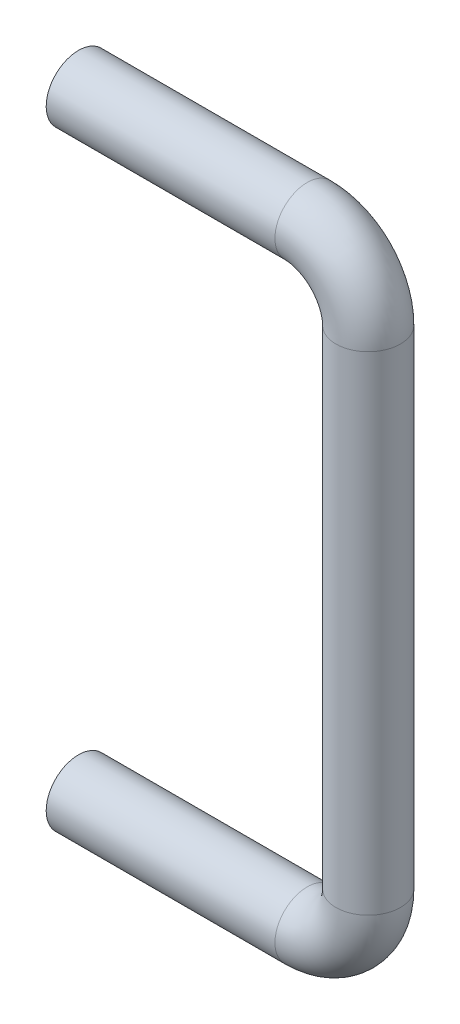
ISO-10303-21;
HEADER;
FILE_DESCRIPTION(('STEP AP214'),'2;1');
FILE_NAME('part.step','',(''),(''),'','','');
FILE_SCHEMA(('AUTOMOTIVE_DESIGN { 1 0 10303 214 1 1 1 1 }'));
ENDSEC;
DATA;
#1=APPLICATION_CONTEXT('core data for automotive mechanical design processes');
#2=APPLICATION_PROTOCOL_DEFINITION('international standard','automotive_design',2000,#1);
#3=PRODUCT_CONTEXT('',#1,'mechanical');
#4=PRODUCT('Part','Part','',(#3));
#5=PRODUCT_RELATED_PRODUCT_CATEGORY('part','',(#4));
#6=PRODUCT_DEFINITION_FORMATION('','',#4);
#7=PRODUCT_DEFINITION_CONTEXT('part definition',#1,'design');
#8=PRODUCT_DEFINITION('design','',#6,#7);
#9=PRODUCT_DEFINITION_SHAPE('','',#8);
#10=(LENGTH_UNIT() NAMED_UNIT(*) SI_UNIT(.MILLI.,.METRE.));
#11=(NAMED_UNIT(*) PLANE_ANGLE_UNIT() SI_UNIT($,.RADIAN.));
#12=(NAMED_UNIT(*) SI_UNIT($,.STERADIAN.) SOLID_ANGLE_UNIT());
#13=UNCERTAINTY_MEASURE_WITH_UNIT(LENGTH_MEASURE(1.E-05),#10,'distance_accuracy_value','');
#14=(GEOMETRIC_REPRESENTATION_CONTEXT(3) GLOBAL_UNCERTAINTY_ASSIGNED_CONTEXT((#13)) GLOBAL_UNIT_ASSIGNED_CONTEXT((#10,
#11,#12)) REPRESENTATION_CONTEXT('',''));
#15=CARTESIAN_POINT('',(0.,0.,0.));
#16=DIRECTION('',(0.,0.,1.));
#17=DIRECTION('',(1.,0.,0.));
#18=AXIS2_PLACEMENT_3D('',#15,#16,#17);
#19=CARTESIAN_POINT('',(131.5,40.,50.));
#20=DIRECTION('',(-1.,0.,0.));
#21=DIRECTION('',(0.,0.,-1.));
#22=AXIS2_PLACEMENT_3D('',#19,#20,#21);
#23=PLANE('',#22);
#24=CARTESIAN_POINT('',(131.5,40.,50.));
#25=DIRECTION('',(-1.,0.,0.));
#26=DIRECTION('',(0.,0.,-1.));
#27=AXIS2_PLACEMENT_3D('',#24,#25,#26);
#28=CIRCLE('',#27,2.175);
#29=CARTESIAN_POINT('',(131.5,40.,47.825));
#30=VERTEX_POINT('',#29);
#31=EDGE_CURVE('E213',#30,#30,#28,.T.);
#32=ORIENTED_EDGE('',*,*,#31,.F.);
#33=EDGE_LOOP('',(#32));
#34=FACE_BOUND('',#33,.T.);
#35=CARTESIAN_POINT('',(131.5,40.,50.));
#36=DIRECTION('',(-1.,0.,0.));
#37=DIRECTION('',(0.,0.,1.));
#38=AXIS2_PLACEMENT_3D('',#35,#36,#37);
#39=CIRCLE('',#38,3.175);
#40=CARTESIAN_POINT('',(131.5,40.,53.175));
#41=VERTEX_POINT('',#40);
#42=EDGE_CURVE('E75',#41,#41,#39,.T.);
#43=ORIENTED_EDGE('',*,*,#42,.T.);
#44=EDGE_LOOP('',(#43));
#45=FACE_BOUND('',#44,.T.);
#46=ADVANCED_FACE('F52',(#34,#45),#23,.T.);
#47=CARTESIAN_POINT('',(131.5,100.,50.));
#48=DIRECTION('',(1.,0.,0.));
#49=DIRECTION('',(0.,0.,-1.));
#50=AXIS2_PLACEMENT_3D('',#47,#48,#49);
#51=PLANE('',#50);
#52=CARTESIAN_POINT('',(131.5,100.,50.));
#53=DIRECTION('',(1.,0.,0.));
#54=DIRECTION('',(0.,0.,-1.));
#55=AXIS2_PLACEMENT_3D('',#52,#53,#54);
#56=CIRCLE('',#55,2.175);
#57=CARTESIAN_POINT('',(131.5,100.,47.825));
#58=VERTEX_POINT('',#57);
#59=EDGE_CURVE('E73',#58,#58,#56,.T.);
#60=ORIENTED_EDGE('',*,*,#59,.T.);
#61=EDGE_LOOP('',(#60));
#62=FACE_BOUND('',#61,.T.);
#63=CARTESIAN_POINT('',(131.5,100.,50.));
#64=DIRECTION('',(1.,0.,0.));
#65=DIRECTION('',(0.,0.,-1.));
#66=AXIS2_PLACEMENT_3D('',#63,#64,#65);
#67=CIRCLE('',#66,3.175);
#68=CARTESIAN_POINT('',(131.5,100.,46.825));
#69=VERTEX_POINT('',#68);
#70=EDGE_CURVE('E11',#69,#69,#67,.T.);
#71=ORIENTED_EDGE('',*,*,#70,.F.);
#72=EDGE_LOOP('',(#71));
#73=FACE_BOUND('',#72,.T.);
#74=ADVANCED_FACE('F132',(#62,#73),#51,.F.);
#75=CARTESIAN_POINT('',(131.5,40.,50.));
#76=DIRECTION('',(1.,0.,0.));
#77=DIRECTION('',(0.,0.,-1.));
#78=AXIS2_PLACEMENT_3D('',#75,#76,#77);
#79=CYLINDRICAL_SURFACE('',#78,3.175);
#80=CARTESIAN_POINT('',(154.,40.,50.));
#81=DIRECTION('',(1.,0.,0.));
#82=DIRECTION('',(0.,0.,-1.));
#83=AXIS2_PLACEMENT_3D('',#80,#81,#82);
#84=CIRCLE('',#83,3.175);
#85=CARTESIAN_POINT('',(154.,36.825,50.));
#86=VERTEX_POINT('',#85);
#87=EDGE_CURVE('E74',#86,#86,#84,.F.);
#88=ORIENTED_EDGE('',*,*,#87,.T.);
#89=EDGE_LOOP('',(#88));
#90=FACE_BOUND('',#89,.T.);
#91=ORIENTED_EDGE('',*,*,#42,.F.);
#92=EDGE_LOOP('',(#91));
#93=FACE_BOUND('',#92,.T.);
#94=ADVANCED_FACE('F102',(#90,#93),#79,.T.);
#95=CARTESIAN_POINT('',(154.,46.,50.));
#96=DIRECTION('',(0.,0.,1.));
#97=DIRECTION('',(1.,0.,0.));
#98=AXIS2_PLACEMENT_3D('',#95,#96,#97);
#99=TOROIDAL_SURFACE('',#98,5.99999999999999,3.175);
#100=CARTESIAN_POINT('',(160.,46.,50.));
#101=DIRECTION('',(0.,-1.,0.));
#102=DIRECTION('',(1.,0.,0.));
#103=AXIS2_PLACEMENT_3D('',#100,#101,#102);
#104=CIRCLE('',#103,3.175);
#105=CARTESIAN_POINT('',(163.175,46.,50.));
#106=VERTEX_POINT('',#105);
#107=EDGE_CURVE('E68',#106,#106,#104,.T.);
#108=CARTESIAN_POINT('',(154.,46.,50.));
#109=DIRECTION('',(0.,0.,1.));
#110=DIRECTION('',(1.,0.,0.));
#111=AXIS2_PLACEMENT_3D('',#108,#109,#110);
#112=CIRCLE('',#111,9.17499999999999);
#113=EDGE_CURVE('',#86,#106,#112,.T.);
#114=ORIENTED_EDGE('',*,*,#87,.F.);
#115=ORIENTED_EDGE('',*,*,#107,.T.);
#116=ORIENTED_EDGE('',*,*,#113,.T.);
#117=ORIENTED_EDGE('',*,*,#113,.F.);
#118=EDGE_LOOP('',(#114,#116,#115,#117));
#119=FACE_BOUND('',#118,.T.);
#120=ADVANCED_FACE('F95',(#119),#99,.T.);
#121=CARTESIAN_POINT('',(160.,46.,50.));
#122=DIRECTION('',(0.,1.,0.));
#123=DIRECTION('',(0.,0.,1.));
#124=AXIS2_PLACEMENT_3D('',#121,#122,#123);
#125=CYLINDRICAL_SURFACE('',#124,3.175);
#126=CARTESIAN_POINT('',(160.,94.,50.));
#127=DIRECTION('',(0.,1.,0.));
#128=DIRECTION('',(0.,0.,1.));
#129=AXIS2_PLACEMENT_3D('',#126,#127,#128);
#130=CIRCLE('',#129,3.175);
#131=CARTESIAN_POINT('',(163.175,94.,50.));
#132=VERTEX_POINT('',#131);
#133=EDGE_CURVE('E63',#132,#132,#130,.F.);
#134=ORIENTED_EDGE('',*,*,#133,.T.);
#135=EDGE_LOOP('',(#134));
#136=FACE_BOUND('',#135,.T.);
#137=ORIENTED_EDGE('',*,*,#107,.F.);
#138=EDGE_LOOP('',(#137));
#139=FACE_BOUND('',#138,.T.);
#140=ADVANCED_FACE('F92',(#136,#139),#125,.T.);
#141=CARTESIAN_POINT('',(154.,94.,50.));
#142=DIRECTION('',(0.,0.,1.));
#143=DIRECTION('',(1.,0.,0.));
#144=AXIS2_PLACEMENT_3D('',#141,#142,#143);
#145=TOROIDAL_SURFACE('',#144,6.00000000000001,3.175);
#146=CARTESIAN_POINT('',(154.,100.,50.));
#147=DIRECTION('',(1.,0.,0.));
#148=DIRECTION('',(0.,1.,0.));
#149=AXIS2_PLACEMENT_3D('',#146,#147,#148);
#150=CIRCLE('',#149,3.175);
#151=CARTESIAN_POINT('',(154.,103.175,50.));
#152=VERTEX_POINT('',#151);
#153=EDGE_CURVE('E58',#152,#152,#150,.T.);
#154=CARTESIAN_POINT('',(154.,94.,50.));
#155=DIRECTION('',(0.,0.,1.));
#156=DIRECTION('',(1.,0.,0.));
#157=AXIS2_PLACEMENT_3D('',#154,#155,#156);
#158=CIRCLE('',#157,9.175);
#159=EDGE_CURVE('',#132,#152,#158,.T.);
#160=ORIENTED_EDGE('',*,*,#133,.F.);
#161=ORIENTED_EDGE('',*,*,#153,.T.);
#162=ORIENTED_EDGE('',*,*,#159,.T.);
#163=ORIENTED_EDGE('',*,*,#159,.F.);
#164=EDGE_LOOP('',(#160,#162,#161,#163));
#165=FACE_BOUND('',#164,.T.);
#166=ADVANCED_FACE('F100',(#165),#145,.T.);
#167=CARTESIAN_POINT('',(154.,100.,50.));
#168=DIRECTION('',(-1.,0.,0.));
#169=DIRECTION('',(0.,0.,1.));
#170=AXIS2_PLACEMENT_3D('',#167,#168,#169);
#171=CYLINDRICAL_SURFACE('',#170,3.175);
#172=ORIENTED_EDGE('',*,*,#70,.T.);
#173=EDGE_LOOP('',(#172));
#174=FACE_BOUND('',#173,.T.);
#175=ORIENTED_EDGE('',*,*,#153,.F.);
#176=EDGE_LOOP('',(#175));
#177=FACE_BOUND('',#176,.T.);
#178=ADVANCED_FACE('F54',(#174,#177),#171,.T.);
#179=CARTESIAN_POINT('',(131.5,40.,50.));
#180=DIRECTION('',(1.,0.,0.));
#181=DIRECTION('',(0.,0.,-1.));
#182=AXIS2_PLACEMENT_3D('',#179,#180,#181);
#183=CYLINDRICAL_SURFACE('',#182,2.175);
#184=CARTESIAN_POINT('',(154.,40.,50.));
#185=DIRECTION('',(-1.,0.,0.));
#186=DIRECTION('',(0.,0.,-1.));
#187=AXIS2_PLACEMENT_3D('',#184,#185,#186);
#188=CIRCLE('',#187,2.175);
#189=CARTESIAN_POINT('',(154.,37.825,50.));
#190=VERTEX_POINT('',#189);
#191=EDGE_CURVE('E212',#190,#190,#188,.T.);
#192=ORIENTED_EDGE('',*,*,#191,.F.);
#193=EDGE_LOOP('',(#192));
#194=FACE_BOUND('',#193,.T.);
#195=ORIENTED_EDGE('',*,*,#31,.T.);
#196=EDGE_LOOP('',(#195));
#197=FACE_BOUND('',#196,.T.);
#198=ADVANCED_FACE('F110',(#194,#197),#183,.F.);
#199=CARTESIAN_POINT('',(154.,46.,50.));
#200=DIRECTION('',(0.,0.,1.));
#201=DIRECTION('',(1.,0.,0.));
#202=AXIS2_PLACEMENT_3D('',#199,#200,#201);
#203=TOROIDAL_SURFACE('',#202,5.99999999999999,2.175);
#204=CARTESIAN_POINT('',(160.,46.,50.));
#205=DIRECTION('',(0.,-1.,0.));
#206=DIRECTION('',(0.,0.,-1.));
#207=AXIS2_PLACEMENT_3D('',#204,#205,#206);
#208=CIRCLE('',#207,2.175);
#209=CARTESIAN_POINT('',(162.175,46.,50.));
#210=VERTEX_POINT('',#209);
#211=EDGE_CURVE('E220',#210,#210,#208,.T.);
#212=CARTESIAN_POINT('',(154.,46.,50.));
#213=DIRECTION('',(0.,0.,1.));
#214=DIRECTION('',(1.,0.,0.));
#215=AXIS2_PLACEMENT_3D('',#212,#213,#214);
#216=CIRCLE('',#215,8.17499999999999);
#217=EDGE_CURVE('',#190,#210,#216,.T.);
#218=ORIENTED_EDGE('',*,*,#191,.T.);
#219=ORIENTED_EDGE('',*,*,#211,.F.);
#220=ORIENTED_EDGE('',*,*,#217,.T.);
#221=ORIENTED_EDGE('',*,*,#217,.F.);
#222=EDGE_LOOP('',(#218,#220,#219,#221));
#223=FACE_BOUND('',#222,.T.);
#224=ADVANCED_FACE('F112',(#223),#203,.F.);
#225=CARTESIAN_POINT('',(160.,46.,50.));
#226=DIRECTION('',(0.,1.,0.));
#227=DIRECTION('',(0.,0.,1.));
#228=AXIS2_PLACEMENT_3D('',#225,#226,#227);
#229=CYLINDRICAL_SURFACE('',#228,2.175);
#230=CARTESIAN_POINT('',(160.,94.,50.));
#231=DIRECTION('',(0.,-1.,0.));
#232=DIRECTION('',(0.,0.,-1.));
#233=AXIS2_PLACEMENT_3D('',#230,#231,#232);
#234=CIRCLE('',#233,2.175);
#235=CARTESIAN_POINT('',(162.175,94.,50.));
#236=VERTEX_POINT('',#235);
#237=EDGE_CURVE('E88',#236,#236,#234,.T.);
#238=ORIENTED_EDGE('',*,*,#237,.F.);
#239=EDGE_LOOP('',(#238));
#240=FACE_BOUND('',#239,.T.);
#241=ORIENTED_EDGE('',*,*,#211,.T.);
#242=EDGE_LOOP('',(#241));
#243=FACE_BOUND('',#242,.T.);
#244=ADVANCED_FACE('F120',(#240,#243),#229,.F.);
#245=CARTESIAN_POINT('',(154.,94.,50.));
#246=DIRECTION('',(0.,0.,1.));
#247=DIRECTION('',(1.,0.,0.));
#248=AXIS2_PLACEMENT_3D('',#245,#246,#247);
#249=TOROIDAL_SURFACE('',#248,6.00000000000001,2.175);
#250=CARTESIAN_POINT('',(154.,100.,50.));
#251=DIRECTION('',(1.,0.,0.));
#252=DIRECTION('',(0.,0.,-1.));
#253=AXIS2_PLACEMENT_3D('',#250,#251,#252);
#254=CIRCLE('',#253,2.175);
#255=CARTESIAN_POINT('',(154.,102.175,50.));
#256=VERTEX_POINT('',#255);
#257=EDGE_CURVE('E81',#256,#256,#254,.T.);
#258=CARTESIAN_POINT('',(154.,94.,50.));
#259=DIRECTION('',(0.,0.,1.));
#260=DIRECTION('',(1.,0.,0.));
#261=AXIS2_PLACEMENT_3D('',#258,#259,#260);
#262=CIRCLE('',#261,8.175);
#263=EDGE_CURVE('',#236,#256,#262,.T.);
#264=ORIENTED_EDGE('',*,*,#237,.T.);
#265=ORIENTED_EDGE('',*,*,#257,.F.);
#266=ORIENTED_EDGE('',*,*,#263,.T.);
#267=ORIENTED_EDGE('',*,*,#263,.F.);
#268=EDGE_LOOP('',(#264,#266,#265,#267));
#269=FACE_BOUND('',#268,.T.);
#270=ADVANCED_FACE('F127',(#269),#249,.F.);
#271=CARTESIAN_POINT('',(154.,100.,50.));
#272=DIRECTION('',(-1.,0.,0.));
#273=DIRECTION('',(0.,0.,1.));
#274=AXIS2_PLACEMENT_3D('',#271,#272,#273);
#275=CYLINDRICAL_SURFACE('',#274,2.175);
#276=ORIENTED_EDGE('',*,*,#59,.F.);
#277=EDGE_LOOP('',(#276));
#278=FACE_BOUND('',#277,.T.);
#279=ORIENTED_EDGE('',*,*,#257,.T.);
#280=EDGE_LOOP('',(#279));
#281=FACE_BOUND('',#280,.T.);
#282=ADVANCED_FACE('F128',(#278,#281),#275,.F.);
#283=CLOSED_SHELL('',(#46,#74,#94,#120,#140,#166,#178,#198,#224,#244,#270,#282));
#284=MANIFOLD_SOLID_BREP('B2',#283);
#285=ADVANCED_BREP_SHAPE_REPRESENTATION('',(#18,#284),#14);
#286=SHAPE_DEFINITION_REPRESENTATION(#9,#285);
ENDSEC;
END-ISO-10303-21;
